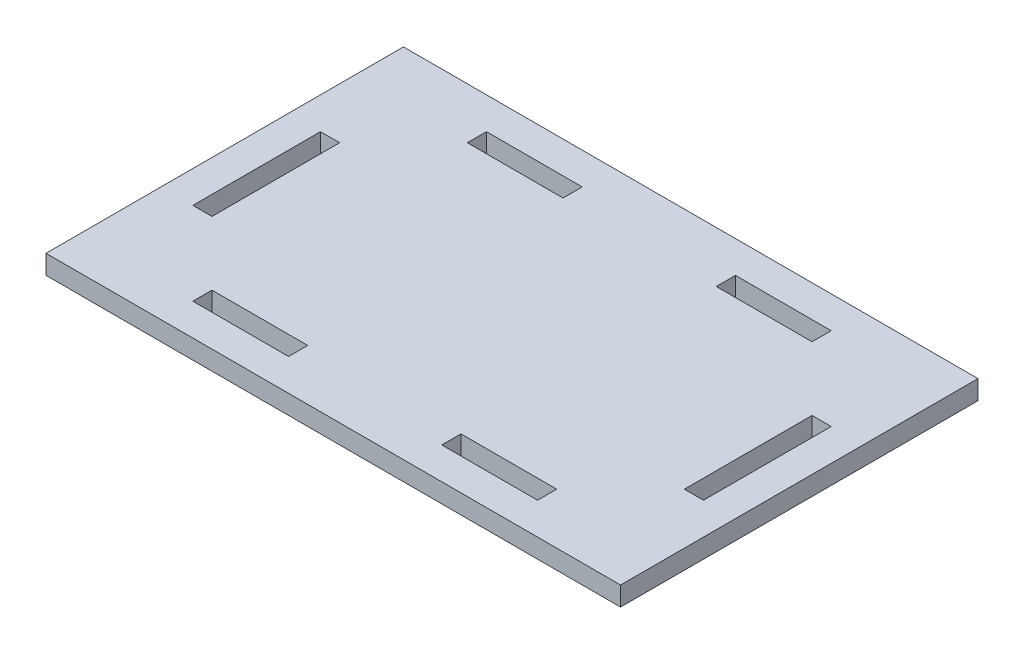
ISO-10303-21;
HEADER;
FILE_DESCRIPTION(('STEP AP214'),'2;1');
FILE_NAME('part.step','',(''),(''),'','','');
FILE_SCHEMA(('AUTOMOTIVE_DESIGN { 1 0 10303 214 1 1 1 1 }'));
ENDSEC;
DATA;
#1=APPLICATION_CONTEXT('core data for automotive mechanical design processes');
#2=APPLICATION_PROTOCOL_DEFINITION('international standard','automotive_design',2000,#1);
#3=PRODUCT_CONTEXT('',#1,'mechanical');
#4=PRODUCT('Part','Part','',(#3));
#5=PRODUCT_RELATED_PRODUCT_CATEGORY('part','',(#4));
#6=PRODUCT_DEFINITION_FORMATION('','',#4);
#7=PRODUCT_DEFINITION_CONTEXT('part definition',#1,'design');
#8=PRODUCT_DEFINITION('design','',#6,#7);
#9=PRODUCT_DEFINITION_SHAPE('','',#8);
#10=(LENGTH_UNIT() NAMED_UNIT(*) SI_UNIT(.MILLI.,.METRE.));
#11=(NAMED_UNIT(*) PLANE_ANGLE_UNIT() SI_UNIT($,.RADIAN.));
#12=(NAMED_UNIT(*) SI_UNIT($,.STERADIAN.) SOLID_ANGLE_UNIT());
#13=UNCERTAINTY_MEASURE_WITH_UNIT(LENGTH_MEASURE(1.E-05),#10,'distance_accuracy_value','');
#14=(GEOMETRIC_REPRESENTATION_CONTEXT(3) GLOBAL_UNCERTAINTY_ASSIGNED_CONTEXT((#13)) GLOBAL_UNIT_ASSIGNED_CONTEXT((#10,
#11,#12)) REPRESENTATION_CONTEXT('',''));
#15=CARTESIAN_POINT('',(0.,0.,0.));
#16=DIRECTION('',(0.,0.,1.));
#17=DIRECTION('',(1.,0.,0.));
#18=AXIS2_PLACEMENT_3D('',#15,#16,#17);
#19=CARTESIAN_POINT('',(0.,3.,0.));
#20=DIRECTION('',(0.,1.,0.));
#21=DIRECTION('',(0.,0.,1.));
#22=AXIS2_PLACEMENT_3D('',#19,#20,#21);
#23=PLANE('',#22);
#24=DIRECTION('',(0.,0.,-1.));
#25=VECTOR('',#24,1.);
#26=CARTESIAN_POINT('',(45.,3.,-28.));
#27=LINE('',#26,#25);
#28=CARTESIAN_POINT('',(45.,3.,28.));
#29=VERTEX_POINT('',#28);
#30=CARTESIAN_POINT('',(45.,3.,-28.));
#31=VERTEX_POINT('',#30);
#32=EDGE_CURVE('E414',#29,#31,#27,.T.);
#33=ORIENTED_EDGE('',*,*,#32,.T.);
#34=DIRECTION('',(-1.,0.,0.));
#35=VECTOR('',#34,1.);
#36=CARTESIAN_POINT('',(-45.,3.,-28.));
#37=LINE('',#36,#35);
#38=CARTESIAN_POINT('',(-45.,3.,-28.));
#39=VERTEX_POINT('',#38);
#40=EDGE_CURVE('E417',#31,#39,#37,.T.);
#41=ORIENTED_EDGE('',*,*,#40,.T.);
#42=DIRECTION('',(0.,0.,1.));
#43=VECTOR('',#42,1.);
#44=CARTESIAN_POINT('',(-45.,3.,-28.));
#45=LINE('',#44,#43);
#46=CARTESIAN_POINT('',(-45.,3.,28.));
#47=VERTEX_POINT('',#46);
#48=EDGE_CURVE('E420',#39,#47,#45,.T.);
#49=ORIENTED_EDGE('',*,*,#48,.T.);
#50=DIRECTION('',(1.,0.,0.));
#51=VECTOR('',#50,1.);
#52=CARTESIAN_POINT('',(-45.,3.,28.));
#53=LINE('',#52,#51);
#54=EDGE_CURVE('E422',#47,#29,#53,.T.);
#55=ORIENTED_EDGE('',*,*,#54,.T.);
#56=EDGE_LOOP('',(#33,#41,#49,#55));
#57=FACE_BOUND('',#56,.T.);
#58=DIRECTION('',(1.,0.,0.));
#59=VECTOR('',#58,1.);
#60=CARTESIAN_POINT('',(-40.,3.,10.));
#61=LINE('',#60,#59);
#62=CARTESIAN_POINT('',(-40.,3.,10.));
#63=VERTEX_POINT('',#62);
#64=CARTESIAN_POINT('',(-37.,3.,10.));
#65=VERTEX_POINT('',#64);
#66=EDGE_CURVE('E385',#63,#65,#61,.T.);
#67=ORIENTED_EDGE('',*,*,#66,.F.);
#68=DIRECTION('',(0.,0.,1.));
#69=VECTOR('',#68,1.);
#70=CARTESIAN_POINT('',(-40.,3.,-10.));
#71=LINE('',#70,#69);
#72=CARTESIAN_POINT('',(-40.,3.,-10.));
#73=VERTEX_POINT('',#72);
#74=EDGE_CURVE('E383',#73,#63,#71,.T.);
#75=ORIENTED_EDGE('',*,*,#74,.F.);
#76=DIRECTION('',(-1.,0.,0.));
#77=VECTOR('',#76,1.);
#78=CARTESIAN_POINT('',(-40.,3.,-10.));
#79=LINE('',#78,#77);
#80=CARTESIAN_POINT('',(-37.,3.,-10.));
#81=VERTEX_POINT('',#80);
#82=EDGE_CURVE('E391',#81,#73,#79,.T.);
#83=ORIENTED_EDGE('',*,*,#82,.F.);
#84=DIRECTION('',(0.,0.,-1.));
#85=VECTOR('',#84,1.);
#86=CARTESIAN_POINT('',(-37.,3.,-10.));
#87=LINE('',#86,#85);
#88=EDGE_CURVE('E388',#65,#81,#87,.T.);
#89=ORIENTED_EDGE('',*,*,#88,.F.);
#90=EDGE_LOOP('',(#67,#75,#83,#89));
#91=FACE_BOUND('',#90,.T.);
#92=DIRECTION('',(-1.,0.,0.));
#93=VECTOR('',#92,1.);
#94=CARTESIAN_POINT('',(40.,3.,-10.));
#95=LINE('',#94,#93);
#96=CARTESIAN_POINT('',(40.,3.,-10.));
#97=VERTEX_POINT('',#96);
#98=CARTESIAN_POINT('',(37.,3.,-10.));
#99=VERTEX_POINT('',#98);
#100=EDGE_CURVE('E354',#97,#99,#95,.T.);
#101=ORIENTED_EDGE('',*,*,#100,.F.);
#102=DIRECTION('',(0.,0.,-1.));
#103=VECTOR('',#102,1.);
#104=CARTESIAN_POINT('',(40.,3.,-10.));
#105=LINE('',#104,#103);
#106=CARTESIAN_POINT('',(40.,3.,10.));
#107=VERTEX_POINT('',#106);
#108=EDGE_CURVE('E352',#107,#97,#105,.T.);
#109=ORIENTED_EDGE('',*,*,#108,.F.);
#110=DIRECTION('',(1.,0.,0.));
#111=VECTOR('',#110,1.);
#112=CARTESIAN_POINT('',(40.,3.,10.));
#113=LINE('',#112,#111);
#114=CARTESIAN_POINT('',(37.,3.,10.));
#115=VERTEX_POINT('',#114);
#116=EDGE_CURVE('E360',#115,#107,#113,.T.);
#117=ORIENTED_EDGE('',*,*,#116,.F.);
#118=DIRECTION('',(0.,0.,1.));
#119=VECTOR('',#118,1.);
#120=CARTESIAN_POINT('',(37.,3.,-10.));
#121=LINE('',#120,#119);
#122=EDGE_CURVE('E357',#99,#115,#121,.T.);
#123=ORIENTED_EDGE('',*,*,#122,.F.);
#124=EDGE_LOOP('',(#101,#109,#117,#123));
#125=FACE_BOUND('',#124,.T.);
#126=DIRECTION('',(1.,0.,0.));
#127=VECTOR('',#126,1.);
#128=CARTESIAN_POINT('',(-27.,3.,-20.));
#129=LINE('',#128,#127);
#130=CARTESIAN_POINT('',(-27.,3.,-20.));
#131=VERTEX_POINT('',#130);
#132=CARTESIAN_POINT('',(-12.,3.,-20.));
#133=VERTEX_POINT('',#132);
#134=EDGE_CURVE('E323',#131,#133,#129,.T.);
#135=ORIENTED_EDGE('',*,*,#134,.F.);
#136=DIRECTION('',(0.,0.,1.));
#137=VECTOR('',#136,1.);
#138=CARTESIAN_POINT('',(-27.,3.,-23.));
#139=LINE('',#138,#137);
#140=CARTESIAN_POINT('',(-27.,3.,-23.));
#141=VERTEX_POINT('',#140);
#142=EDGE_CURVE('E321',#141,#131,#139,.T.);
#143=ORIENTED_EDGE('',*,*,#142,.F.);
#144=DIRECTION('',(-1.,0.,0.));
#145=VECTOR('',#144,1.);
#146=CARTESIAN_POINT('',(-27.,3.,-23.));
#147=LINE('',#146,#145);
#148=CARTESIAN_POINT('',(-12.,3.,-23.));
#149=VERTEX_POINT('',#148);
#150=EDGE_CURVE('E329',#149,#141,#147,.T.);
#151=ORIENTED_EDGE('',*,*,#150,.F.);
#152=DIRECTION('',(0.,0.,-1.));
#153=VECTOR('',#152,1.);
#154=CARTESIAN_POINT('',(-12.,3.,-23.));
#155=LINE('',#154,#153);
#156=EDGE_CURVE('E326',#133,#149,#155,.T.);
#157=ORIENTED_EDGE('',*,*,#156,.F.);
#158=EDGE_LOOP('',(#135,#143,#151,#157));
#159=FACE_BOUND('',#158,.T.);
#160=DIRECTION('',(-1.,0.,0.));
#161=VECTOR('',#160,1.);
#162=CARTESIAN_POINT('',(27.,3.,-23.));
#163=LINE('',#162,#161);
#164=CARTESIAN_POINT('',(27.,3.,-23.));
#165=VERTEX_POINT('',#164);
#166=CARTESIAN_POINT('',(12.,3.,-23.));
#167=VERTEX_POINT('',#166);
#168=EDGE_CURVE('E292',#165,#167,#163,.T.);
#169=ORIENTED_EDGE('',*,*,#168,.F.);
#170=DIRECTION('',(0.,0.,-1.));
#171=VECTOR('',#170,1.);
#172=CARTESIAN_POINT('',(27.,3.,-23.));
#173=LINE('',#172,#171);
#174=CARTESIAN_POINT('',(27.,3.,-20.));
#175=VERTEX_POINT('',#174);
#176=EDGE_CURVE('E290',#175,#165,#173,.T.);
#177=ORIENTED_EDGE('',*,*,#176,.F.);
#178=DIRECTION('',(1.,0.,0.));
#179=VECTOR('',#178,1.);
#180=CARTESIAN_POINT('',(27.,3.,-20.));
#181=LINE('',#180,#179);
#182=CARTESIAN_POINT('',(12.,3.,-20.));
#183=VERTEX_POINT('',#182);
#184=EDGE_CURVE('E298',#183,#175,#181,.T.);
#185=ORIENTED_EDGE('',*,*,#184,.F.);
#186=DIRECTION('',(0.,0.,1.));
#187=VECTOR('',#186,1.);
#188=CARTESIAN_POINT('',(12.,3.,-23.));
#189=LINE('',#188,#187);
#190=EDGE_CURVE('E295',#167,#183,#189,.T.);
#191=ORIENTED_EDGE('',*,*,#190,.F.);
#192=EDGE_LOOP('',(#169,#177,#185,#191));
#193=FACE_BOUND('',#192,.T.);
#194=DIRECTION('',(0.,0.,-1.));
#195=VECTOR('',#194,1.);
#196=CARTESIAN_POINT('',(27.,3.,23.));
#197=LINE('',#196,#195);
#198=CARTESIAN_POINT('',(27.,3.,23.));
#199=VERTEX_POINT('',#198);
#200=CARTESIAN_POINT('',(27.,3.,20.));
#201=VERTEX_POINT('',#200);
#202=EDGE_CURVE('E261',#199,#201,#197,.T.);
#203=ORIENTED_EDGE('',*,*,#202,.F.);
#204=DIRECTION('',(1.,0.,0.));
#205=VECTOR('',#204,1.);
#206=CARTESIAN_POINT('',(27.,3.,23.));
#207=LINE('',#206,#205);
#208=CARTESIAN_POINT('',(12.,3.,23.));
#209=VERTEX_POINT('',#208);
#210=EDGE_CURVE('E259',#209,#199,#207,.T.);
#211=ORIENTED_EDGE('',*,*,#210,.F.);
#212=DIRECTION('',(0.,0.,1.));
#213=VECTOR('',#212,1.);
#214=CARTESIAN_POINT('',(12.,3.,23.));
#215=LINE('',#214,#213);
#216=CARTESIAN_POINT('',(12.,3.,20.));
#217=VERTEX_POINT('',#216);
#218=EDGE_CURVE('E267',#217,#209,#215,.T.);
#219=ORIENTED_EDGE('',*,*,#218,.F.);
#220=DIRECTION('',(-1.,0.,0.));
#221=VECTOR('',#220,1.);
#222=CARTESIAN_POINT('',(27.,3.,20.));
#223=LINE('',#222,#221);
#224=EDGE_CURVE('E264',#201,#217,#223,.T.);
#225=ORIENTED_EDGE('',*,*,#224,.F.);
#226=EDGE_LOOP('',(#203,#211,#219,#225));
#227=FACE_BOUND('',#226,.T.);
#228=DIRECTION('',(1.,0.,0.));
#229=VECTOR('',#228,1.);
#230=CARTESIAN_POINT('',(-27.,3.,23.));
#231=LINE('',#230,#229);
#232=CARTESIAN_POINT('',(-27.,3.,23.));
#233=VERTEX_POINT('',#232);
#234=CARTESIAN_POINT('',(-12.,3.,23.));
#235=VERTEX_POINT('',#234);
#236=EDGE_CURVE('E231',#233,#235,#231,.T.);
#237=ORIENTED_EDGE('',*,*,#236,.F.);
#238=DIRECTION('',(0.,0.,1.));
#239=VECTOR('',#238,1.);
#240=CARTESIAN_POINT('',(-27.,3.,23.));
#241=LINE('',#240,#239);
#242=CARTESIAN_POINT('',(-27.,3.,20.));
#243=VERTEX_POINT('',#242);
#244=EDGE_CURVE('E223',#243,#233,#241,.T.);
#245=ORIENTED_EDGE('',*,*,#244,.F.);
#246=DIRECTION('',(-1.,0.,0.));
#247=VECTOR('',#246,1.);
#248=CARTESIAN_POINT('',(-27.,3.,20.));
#249=LINE('',#248,#247);
#250=CARTESIAN_POINT('',(-12.,3.,20.));
#251=VERTEX_POINT('',#250);
#252=EDGE_CURVE('E245',#251,#243,#249,.T.);
#253=ORIENTED_EDGE('',*,*,#252,.F.);
#254=DIRECTION('',(0.,0.,-1.));
#255=VECTOR('',#254,1.);
#256=CARTESIAN_POINT('',(-12.,3.,23.));
#257=LINE('',#256,#255);
#258=EDGE_CURVE('E243',#235,#251,#257,.T.);
#259=ORIENTED_EDGE('',*,*,#258,.F.);
#260=EDGE_LOOP('',(#237,#245,#253,#259));
#261=FACE_BOUND('',#260,.T.);
#262=ADVANCED_FACE('F38',(#57,#91,#125,#159,#193,#227,#261),#23,.T.);
#263=CARTESIAN_POINT('',(0.,0.,0.));
#264=DIRECTION('',(0.,1.,0.));
#265=DIRECTION('',(0.,0.,1.));
#266=AXIS2_PLACEMENT_3D('',#263,#264,#265);
#267=PLANE('',#266);
#268=DIRECTION('',(1.,0.,0.));
#269=VECTOR('',#268,1.);
#270=CARTESIAN_POINT('',(27.,0.,23.));
#271=LINE('',#270,#269);
#272=CARTESIAN_POINT('',(12.,0.,23.));
#273=VERTEX_POINT('',#272);
#274=CARTESIAN_POINT('',(27.,0.,23.));
#275=VERTEX_POINT('',#274);
#276=EDGE_CURVE('E239',#273,#275,#271,.T.);
#277=ORIENTED_EDGE('',*,*,#276,.T.);
#278=DIRECTION('',(0.,0.,-1.));
#279=VECTOR('',#278,1.);
#280=CARTESIAN_POINT('',(27.,0.,23.));
#281=LINE('',#280,#279);
#282=CARTESIAN_POINT('',(27.,0.,20.));
#283=VERTEX_POINT('',#282);
#284=EDGE_CURVE('E272',#275,#283,#281,.T.);
#285=ORIENTED_EDGE('',*,*,#284,.T.);
#286=DIRECTION('',(-1.,0.,0.));
#287=VECTOR('',#286,1.);
#288=CARTESIAN_POINT('',(27.,0.,20.));
#289=LINE('',#288,#287);
#290=CARTESIAN_POINT('',(12.,0.,20.));
#291=VERTEX_POINT('',#290);
#292=EDGE_CURVE('E275',#283,#291,#289,.T.);
#293=ORIENTED_EDGE('',*,*,#292,.T.);
#294=DIRECTION('',(0.,0.,1.));
#295=VECTOR('',#294,1.);
#296=CARTESIAN_POINT('',(12.,0.,23.));
#297=LINE('',#296,#295);
#298=EDGE_CURVE('E262',#291,#273,#297,.T.);
#299=ORIENTED_EDGE('',*,*,#298,.T.);
#300=EDGE_LOOP('',(#277,#285,#293,#299));
#301=FACE_BOUND('',#300,.T.);
#302=DIRECTION('',(0.,0.,1.));
#303=VECTOR('',#302,1.);
#304=CARTESIAN_POINT('',(-27.,0.,-23.));
#305=LINE('',#304,#303);
#306=CARTESIAN_POINT('',(-27.,0.,-23.));
#307=VERTEX_POINT('',#306);
#308=CARTESIAN_POINT('',(-27.,0.,-20.));
#309=VERTEX_POINT('',#308);
#310=EDGE_CURVE('E320',#307,#309,#305,.T.);
#311=ORIENTED_EDGE('',*,*,#310,.T.);
#312=DIRECTION('',(1.,0.,0.));
#313=VECTOR('',#312,1.);
#314=CARTESIAN_POINT('',(-27.,0.,-20.));
#315=LINE('',#314,#313);
#316=CARTESIAN_POINT('',(-12.,0.,-20.));
#317=VERTEX_POINT('',#316);
#318=EDGE_CURVE('E334',#309,#317,#315,.T.);
#319=ORIENTED_EDGE('',*,*,#318,.T.);
#320=DIRECTION('',(0.,0.,-1.));
#321=VECTOR('',#320,1.);
#322=CARTESIAN_POINT('',(-12.,0.,-23.));
#323=LINE('',#322,#321);
#324=CARTESIAN_POINT('',(-12.,0.,-23.));
#325=VERTEX_POINT('',#324);
#326=EDGE_CURVE('E337',#317,#325,#323,.T.);
#327=ORIENTED_EDGE('',*,*,#326,.T.);
#328=DIRECTION('',(-1.,0.,0.));
#329=VECTOR('',#328,1.);
#330=CARTESIAN_POINT('',(-27.,0.,-23.));
#331=LINE('',#330,#329);
#332=EDGE_CURVE('E324',#325,#307,#331,.T.);
#333=ORIENTED_EDGE('',*,*,#332,.T.);
#334=EDGE_LOOP('',(#311,#319,#327,#333));
#335=FACE_BOUND('',#334,.T.);
#336=DIRECTION('',(0.,0.,1.));
#337=VECTOR('',#336,1.);
#338=CARTESIAN_POINT('',(-40.,0.,-10.));
#339=LINE('',#338,#337);
#340=CARTESIAN_POINT('',(-40.,0.,-10.));
#341=VERTEX_POINT('',#340);
#342=CARTESIAN_POINT('',(-40.,0.,10.));
#343=VERTEX_POINT('',#342);
#344=EDGE_CURVE('E382',#341,#343,#339,.T.);
#345=ORIENTED_EDGE('',*,*,#344,.T.);
#346=DIRECTION('',(1.,0.,0.));
#347=VECTOR('',#346,1.);
#348=CARTESIAN_POINT('',(-40.,0.,10.));
#349=LINE('',#348,#347);
#350=CARTESIAN_POINT('',(-37.,0.,10.));
#351=VERTEX_POINT('',#350);
#352=EDGE_CURVE('E396',#343,#351,#349,.T.);
#353=ORIENTED_EDGE('',*,*,#352,.T.);
#354=DIRECTION('',(0.,0.,-1.));
#355=VECTOR('',#354,1.);
#356=CARTESIAN_POINT('',(-37.,0.,-10.));
#357=LINE('',#356,#355);
#358=CARTESIAN_POINT('',(-37.,0.,-10.));
#359=VERTEX_POINT('',#358);
#360=EDGE_CURVE('E399',#351,#359,#357,.T.);
#361=ORIENTED_EDGE('',*,*,#360,.T.);
#362=DIRECTION('',(-1.,0.,0.));
#363=VECTOR('',#362,1.);
#364=CARTESIAN_POINT('',(-40.,0.,-10.));
#365=LINE('',#364,#363);
#366=EDGE_CURVE('E386',#359,#341,#365,.T.);
#367=ORIENTED_EDGE('',*,*,#366,.T.);
#368=EDGE_LOOP('',(#345,#353,#361,#367));
#369=FACE_BOUND('',#368,.T.);
#370=DIRECTION('',(0.,0.,-1.));
#371=VECTOR('',#370,1.);
#372=CARTESIAN_POINT('',(45.,0.,-28.));
#373=LINE('',#372,#371);
#374=CARTESIAN_POINT('',(45.,0.,28.));
#375=VERTEX_POINT('',#374);
#376=CARTESIAN_POINT('',(45.,0.,-28.));
#377=VERTEX_POINT('',#376);
#378=EDGE_CURVE('E413',#375,#377,#373,.T.);
#379=ORIENTED_EDGE('',*,*,#378,.F.);
#380=DIRECTION('',(1.,0.,0.));
#381=VECTOR('',#380,1.);
#382=CARTESIAN_POINT('',(-45.,0.,28.));
#383=LINE('',#382,#381);
#384=CARTESIAN_POINT('',(-45.,0.,28.));
#385=VERTEX_POINT('',#384);
#386=EDGE_CURVE('E418',#385,#375,#383,.T.);
#387=ORIENTED_EDGE('',*,*,#386,.F.);
#388=DIRECTION('',(0.,0.,1.));
#389=VECTOR('',#388,1.);
#390=CARTESIAN_POINT('',(-45.,0.,-28.));
#391=LINE('',#390,#389);
#392=CARTESIAN_POINT('',(-45.,0.,-28.));
#393=VERTEX_POINT('',#392);
#394=EDGE_CURVE('E429',#393,#385,#391,.T.);
#395=ORIENTED_EDGE('',*,*,#394,.F.);
#396=DIRECTION('',(-1.,0.,0.));
#397=VECTOR('',#396,1.);
#398=CARTESIAN_POINT('',(-45.,0.,-28.));
#399=LINE('',#398,#397);
#400=EDGE_CURVE('E427',#377,#393,#399,.T.);
#401=ORIENTED_EDGE('',*,*,#400,.F.);
#402=EDGE_LOOP('',(#379,#387,#395,#401));
#403=FACE_BOUND('',#402,.T.);
#404=DIRECTION('',(0.,0.,-1.));
#405=VECTOR('',#404,1.);
#406=CARTESIAN_POINT('',(40.,0.,-10.));
#407=LINE('',#406,#405);
#408=CARTESIAN_POINT('',(40.,0.,10.));
#409=VERTEX_POINT('',#408);
#410=CARTESIAN_POINT('',(40.,0.,-10.));
#411=VERTEX_POINT('',#410);
#412=EDGE_CURVE('E351',#409,#411,#407,.T.);
#413=ORIENTED_EDGE('',*,*,#412,.T.);
#414=DIRECTION('',(-1.,0.,0.));
#415=VECTOR('',#414,1.);
#416=CARTESIAN_POINT('',(40.,0.,-10.));
#417=LINE('',#416,#415);
#418=CARTESIAN_POINT('',(37.,0.,-10.));
#419=VERTEX_POINT('',#418);
#420=EDGE_CURVE('E365',#411,#419,#417,.T.);
#421=ORIENTED_EDGE('',*,*,#420,.T.);
#422=DIRECTION('',(0.,0.,1.));
#423=VECTOR('',#422,1.);
#424=CARTESIAN_POINT('',(37.,0.,-10.));
#425=LINE('',#424,#423);
#426=CARTESIAN_POINT('',(37.,0.,10.));
#427=VERTEX_POINT('',#426);
#428=EDGE_CURVE('E368',#419,#427,#425,.T.);
#429=ORIENTED_EDGE('',*,*,#428,.T.);
#430=DIRECTION('',(1.,0.,0.));
#431=VECTOR('',#430,1.);
#432=CARTESIAN_POINT('',(40.,0.,10.));
#433=LINE('',#432,#431);
#434=EDGE_CURVE('E355',#427,#409,#433,.T.);
#435=ORIENTED_EDGE('',*,*,#434,.T.);
#436=EDGE_LOOP('',(#413,#421,#429,#435));
#437=FACE_BOUND('',#436,.T.);
#438=DIRECTION('',(0.,0.,-1.));
#439=VECTOR('',#438,1.);
#440=CARTESIAN_POINT('',(27.,0.,-23.));
#441=LINE('',#440,#439);
#442=CARTESIAN_POINT('',(27.,0.,-20.));
#443=VERTEX_POINT('',#442);
#444=CARTESIAN_POINT('',(27.,0.,-23.));
#445=VERTEX_POINT('',#444);
#446=EDGE_CURVE('E289',#443,#445,#441,.T.);
#447=ORIENTED_EDGE('',*,*,#446,.T.);
#448=DIRECTION('',(-1.,0.,0.));
#449=VECTOR('',#448,1.);
#450=CARTESIAN_POINT('',(27.,0.,-23.));
#451=LINE('',#450,#449);
#452=CARTESIAN_POINT('',(12.,0.,-23.));
#453=VERTEX_POINT('',#452);
#454=EDGE_CURVE('E303',#445,#453,#451,.T.);
#455=ORIENTED_EDGE('',*,*,#454,.T.);
#456=DIRECTION('',(0.,0.,1.));
#457=VECTOR('',#456,1.);
#458=CARTESIAN_POINT('',(12.,0.,-23.));
#459=LINE('',#458,#457);
#460=CARTESIAN_POINT('',(12.,0.,-20.));
#461=VERTEX_POINT('',#460);
#462=EDGE_CURVE('E306',#453,#461,#459,.T.);
#463=ORIENTED_EDGE('',*,*,#462,.T.);
#464=DIRECTION('',(1.,0.,0.));
#465=VECTOR('',#464,1.);
#466=CARTESIAN_POINT('',(27.,0.,-20.));
#467=LINE('',#466,#465);
#468=EDGE_CURVE('E293',#461,#443,#467,.T.);
#469=ORIENTED_EDGE('',*,*,#468,.T.);
#470=EDGE_LOOP('',(#447,#455,#463,#469));
#471=FACE_BOUND('',#470,.T.);
#472=DIRECTION('',(0.,0.,1.));
#473=VECTOR('',#472,1.);
#474=CARTESIAN_POINT('',(-27.,0.,23.));
#475=LINE('',#474,#473);
#476=CARTESIAN_POINT('',(-27.,0.,20.));
#477=VERTEX_POINT('',#476);
#478=CARTESIAN_POINT('',(-27.,0.,23.));
#479=VERTEX_POINT('',#478);
#480=EDGE_CURVE('E61',#477,#479,#475,.T.);
#481=ORIENTED_EDGE('',*,*,#480,.T.);
#482=DIRECTION('',(1.,0.,0.));
#483=VECTOR('',#482,1.);
#484=CARTESIAN_POINT('',(-27.,0.,23.));
#485=LINE('',#484,#483);
#486=CARTESIAN_POINT('',(-12.,0.,23.));
#487=VERTEX_POINT('',#486);
#488=EDGE_CURVE('E238',#479,#487,#485,.T.);
#489=ORIENTED_EDGE('',*,*,#488,.T.);
#490=DIRECTION('',(0.,0.,-1.));
#491=VECTOR('',#490,1.);
#492=CARTESIAN_POINT('',(-12.,0.,23.));
#493=LINE('',#492,#491);
#494=CARTESIAN_POINT('',(-12.,0.,20.));
#495=VERTEX_POINT('',#494);
#496=EDGE_CURVE('E251',#487,#495,#493,.T.);
#497=ORIENTED_EDGE('',*,*,#496,.T.);
#498=DIRECTION('',(-1.,0.,0.));
#499=VECTOR('',#498,1.);
#500=CARTESIAN_POINT('',(-27.,0.,20.));
#501=LINE('',#500,#499);
#502=EDGE_CURVE('E232',#495,#477,#501,.T.);
#503=ORIENTED_EDGE('',*,*,#502,.T.);
#504=EDGE_LOOP('',(#481,#489,#497,#503));
#505=FACE_BOUND('',#504,.T.);
#506=ADVANCED_FACE('F447',(#301,#335,#369,#403,#437,#471,#505),#267,.F.);
#507=CARTESIAN_POINT('',(45.,3.,-28.));
#508=DIRECTION('',(-1.,0.,0.));
#509=DIRECTION('',(0.,0.,1.));
#510=AXIS2_PLACEMENT_3D('',#507,#508,#509);
#511=PLANE('',#510);
#512=ORIENTED_EDGE('',*,*,#378,.T.);
#513=DIRECTION('',(0.,-1.,0.));
#514=VECTOR('',#513,1.);
#515=CARTESIAN_POINT('',(45.,3.,-28.));
#516=LINE('',#515,#514);
#517=EDGE_CURVE('E11',#31,#377,#516,.T.);
#518=ORIENTED_EDGE('',*,*,#517,.F.);
#519=ORIENTED_EDGE('',*,*,#32,.F.);
#520=DIRECTION('',(0.,-1.,0.));
#521=VECTOR('',#520,1.);
#522=CARTESIAN_POINT('',(45.,3.,28.));
#523=LINE('',#522,#521);
#524=EDGE_CURVE('E424',#29,#375,#523,.T.);
#525=ORIENTED_EDGE('',*,*,#524,.T.);
#526=EDGE_LOOP('',(#512,#518,#519,#525));
#527=FACE_BOUND('',#526,.T.);
#528=ADVANCED_FACE('F40',(#527),#511,.F.);
#529=CARTESIAN_POINT('',(-45.,3.,-28.));
#530=DIRECTION('',(0.,0.,1.));
#531=DIRECTION('',(1.,0.,0.));
#532=AXIS2_PLACEMENT_3D('',#529,#530,#531);
#533=PLANE('',#532);
#534=ORIENTED_EDGE('',*,*,#400,.T.);
#535=DIRECTION('',(0.,-1.,0.));
#536=VECTOR('',#535,1.);
#537=CARTESIAN_POINT('',(-45.,3.,-28.));
#538=LINE('',#537,#536);
#539=EDGE_CURVE('E46',#39,#393,#538,.T.);
#540=ORIENTED_EDGE('',*,*,#539,.F.);
#541=ORIENTED_EDGE('',*,*,#40,.F.);
#542=ORIENTED_EDGE('',*,*,#517,.T.);
#543=EDGE_LOOP('',(#534,#540,#541,#542));
#544=FACE_BOUND('',#543,.T.);
#545=ADVANCED_FACE('F458',(#544),#533,.F.);
#546=CARTESIAN_POINT('',(-45.,3.,-28.));
#547=DIRECTION('',(1.,0.,0.));
#548=DIRECTION('',(0.,0.,-1.));
#549=AXIS2_PLACEMENT_3D('',#546,#547,#548);
#550=PLANE('',#549);
#551=ORIENTED_EDGE('',*,*,#394,.T.);
#552=DIRECTION('',(0.,-1.,0.));
#553=VECTOR('',#552,1.);
#554=CARTESIAN_POINT('',(-45.,3.,28.));
#555=LINE('',#554,#553);
#556=EDGE_CURVE('E434',#47,#385,#555,.T.);
#557=ORIENTED_EDGE('',*,*,#556,.F.);
#558=ORIENTED_EDGE('',*,*,#48,.F.);
#559=ORIENTED_EDGE('',*,*,#539,.T.);
#560=EDGE_LOOP('',(#551,#557,#558,#559));
#561=FACE_BOUND('',#560,.T.);
#562=ADVANCED_FACE('F441',(#561),#550,.F.);
#563=CARTESIAN_POINT('',(-45.,3.,28.));
#564=DIRECTION('',(0.,0.,-1.));
#565=DIRECTION('',(-1.,0.,0.));
#566=AXIS2_PLACEMENT_3D('',#563,#564,#565);
#567=PLANE('',#566);
#568=ORIENTED_EDGE('',*,*,#386,.T.);
#569=ORIENTED_EDGE('',*,*,#524,.F.);
#570=ORIENTED_EDGE('',*,*,#54,.F.);
#571=ORIENTED_EDGE('',*,*,#556,.T.);
#572=EDGE_LOOP('',(#568,#569,#570,#571));
#573=FACE_BOUND('',#572,.T.);
#574=ADVANCED_FACE('F451',(#573),#567,.F.);
#575=CARTESIAN_POINT('',(-40.,3.,-10.));
#576=DIRECTION('',(1.,0.,0.));
#577=DIRECTION('',(0.,0.,-1.));
#578=AXIS2_PLACEMENT_3D('',#575,#576,#577);
#579=PLANE('',#578);
#580=ORIENTED_EDGE('',*,*,#344,.F.);
#581=DIRECTION('',(0.,-1.,0.));
#582=VECTOR('',#581,1.);
#583=CARTESIAN_POINT('',(-40.,3.,-10.));
#584=LINE('',#583,#582);
#585=EDGE_CURVE('E393',#73,#341,#584,.T.);
#586=ORIENTED_EDGE('',*,*,#585,.F.);
#587=ORIENTED_EDGE('',*,*,#74,.T.);
#588=DIRECTION('',(0.,-1.,0.));
#589=VECTOR('',#588,1.);
#590=CARTESIAN_POINT('',(-40.,3.,10.));
#591=LINE('',#590,#589);
#592=EDGE_CURVE('E410',#63,#343,#591,.T.);
#593=ORIENTED_EDGE('',*,*,#592,.T.);
#594=EDGE_LOOP('',(#580,#586,#587,#593));
#595=FACE_BOUND('',#594,.T.);
#596=ADVANCED_FACE('F473',(#595),#579,.T.);
#597=CARTESIAN_POINT('',(-40.,3.,10.));
#598=DIRECTION('',(0.,0.,-1.));
#599=DIRECTION('',(-1.,0.,0.));
#600=AXIS2_PLACEMENT_3D('',#597,#598,#599);
#601=PLANE('',#600);
#602=ORIENTED_EDGE('',*,*,#352,.F.);
#603=ORIENTED_EDGE('',*,*,#592,.F.);
#604=ORIENTED_EDGE('',*,*,#66,.T.);
#605=DIRECTION('',(0.,-1.,0.));
#606=VECTOR('',#605,1.);
#607=CARTESIAN_POINT('',(-37.,3.,10.));
#608=LINE('',#607,#606);
#609=EDGE_CURVE('E408',#65,#351,#608,.T.);
#610=ORIENTED_EDGE('',*,*,#609,.T.);
#611=EDGE_LOOP('',(#602,#603,#604,#610));
#612=FACE_BOUND('',#611,.T.);
#613=ADVANCED_FACE('F480',(#612),#601,.T.);
#614=CARTESIAN_POINT('',(-37.,3.,-10.));
#615=DIRECTION('',(-1.,0.,0.));
#616=DIRECTION('',(0.,0.,1.));
#617=AXIS2_PLACEMENT_3D('',#614,#615,#616);
#618=PLANE('',#617);
#619=ORIENTED_EDGE('',*,*,#360,.F.);
#620=ORIENTED_EDGE('',*,*,#609,.F.);
#621=ORIENTED_EDGE('',*,*,#88,.T.);
#622=DIRECTION('',(0.,-1.,0.));
#623=VECTOR('',#622,1.);
#624=CARTESIAN_POINT('',(-37.,3.,-10.));
#625=LINE('',#624,#623);
#626=EDGE_CURVE('E406',#81,#359,#625,.T.);
#627=ORIENTED_EDGE('',*,*,#626,.T.);
#628=EDGE_LOOP('',(#619,#620,#621,#627));
#629=FACE_BOUND('',#628,.T.);
#630=ADVANCED_FACE('F485',(#629),#618,.T.);
#631=CARTESIAN_POINT('',(-40.,3.,-10.));
#632=DIRECTION('',(0.,0.,1.));
#633=DIRECTION('',(1.,0.,0.));
#634=AXIS2_PLACEMENT_3D('',#631,#632,#633);
#635=PLANE('',#634);
#636=ORIENTED_EDGE('',*,*,#366,.F.);
#637=ORIENTED_EDGE('',*,*,#626,.F.);
#638=ORIENTED_EDGE('',*,*,#82,.T.);
#639=ORIENTED_EDGE('',*,*,#585,.T.);
#640=EDGE_LOOP('',(#636,#637,#638,#639));
#641=FACE_BOUND('',#640,.T.);
#642=ADVANCED_FACE('F493',(#641),#635,.T.);
#643=CARTESIAN_POINT('',(40.,3.,-10.));
#644=DIRECTION('',(-1.,0.,0.));
#645=DIRECTION('',(0.,0.,1.));
#646=AXIS2_PLACEMENT_3D('',#643,#644,#645);
#647=PLANE('',#646);
#648=ORIENTED_EDGE('',*,*,#412,.F.);
#649=DIRECTION('',(0.,-1.,0.));
#650=VECTOR('',#649,1.);
#651=CARTESIAN_POINT('',(40.,3.,10.));
#652=LINE('',#651,#650);
#653=EDGE_CURVE('E362',#107,#409,#652,.T.);
#654=ORIENTED_EDGE('',*,*,#653,.F.);
#655=ORIENTED_EDGE('',*,*,#108,.T.);
#656=DIRECTION('',(0.,-1.,0.));
#657=VECTOR('',#656,1.);
#658=CARTESIAN_POINT('',(40.,3.,-10.));
#659=LINE('',#658,#657);
#660=EDGE_CURVE('E379',#97,#411,#659,.T.);
#661=ORIENTED_EDGE('',*,*,#660,.T.);
#662=EDGE_LOOP('',(#648,#654,#655,#661));
#663=FACE_BOUND('',#662,.T.);
#664=ADVANCED_FACE('F588',(#663),#647,.T.);
#665=CARTESIAN_POINT('',(40.,3.,-10.));
#666=DIRECTION('',(0.,0.,1.));
#667=DIRECTION('',(1.,0.,0.));
#668=AXIS2_PLACEMENT_3D('',#665,#666,#667);
#669=PLANE('',#668);
#670=ORIENTED_EDGE('',*,*,#420,.F.);
#671=ORIENTED_EDGE('',*,*,#660,.F.);
#672=ORIENTED_EDGE('',*,*,#100,.T.);
#673=DIRECTION('',(0.,-1.,0.));
#674=VECTOR('',#673,1.);
#675=CARTESIAN_POINT('',(37.,3.,-10.));
#676=LINE('',#675,#674);
#677=EDGE_CURVE('E377',#99,#419,#676,.T.);
#678=ORIENTED_EDGE('',*,*,#677,.T.);
#679=EDGE_LOOP('',(#670,#671,#672,#678));
#680=FACE_BOUND('',#679,.T.);
#681=ADVANCED_FACE('F584',(#680),#669,.T.);
#682=CARTESIAN_POINT('',(37.,3.,-10.));
#683=DIRECTION('',(1.,0.,0.));
#684=DIRECTION('',(0.,0.,-1.));
#685=AXIS2_PLACEMENT_3D('',#682,#683,#684);
#686=PLANE('',#685);
#687=ORIENTED_EDGE('',*,*,#428,.F.);
#688=ORIENTED_EDGE('',*,*,#677,.F.);
#689=ORIENTED_EDGE('',*,*,#122,.T.);
#690=DIRECTION('',(0.,-1.,0.));
#691=VECTOR('',#690,1.);
#692=CARTESIAN_POINT('',(37.,3.,10.));
#693=LINE('',#692,#691);
#694=EDGE_CURVE('E375',#115,#427,#693,.T.);
#695=ORIENTED_EDGE('',*,*,#694,.T.);
#696=EDGE_LOOP('',(#687,#688,#689,#695));
#697=FACE_BOUND('',#696,.T.);
#698=ADVANCED_FACE('F580',(#697),#686,.T.);
#699=CARTESIAN_POINT('',(40.,3.,10.));
#700=DIRECTION('',(0.,0.,-1.));
#701=DIRECTION('',(-1.,0.,0.));
#702=AXIS2_PLACEMENT_3D('',#699,#700,#701);
#703=PLANE('',#702);
#704=ORIENTED_EDGE('',*,*,#434,.F.);
#705=ORIENTED_EDGE('',*,*,#694,.F.);
#706=ORIENTED_EDGE('',*,*,#116,.T.);
#707=ORIENTED_EDGE('',*,*,#653,.T.);
#708=EDGE_LOOP('',(#704,#705,#706,#707));
#709=FACE_BOUND('',#708,.T.);
#710=ADVANCED_FACE('F576',(#709),#703,.T.);
#711=CARTESIAN_POINT('',(-27.,3.,-23.));
#712=DIRECTION('',(1.,0.,0.));
#713=DIRECTION('',(0.,0.,-1.));
#714=AXIS2_PLACEMENT_3D('',#711,#712,#713);
#715=PLANE('',#714);
#716=ORIENTED_EDGE('',*,*,#310,.F.);
#717=DIRECTION('',(0.,-1.,0.));
#718=VECTOR('',#717,1.);
#719=CARTESIAN_POINT('',(-27.,3.,-23.));
#720=LINE('',#719,#718);
#721=EDGE_CURVE('E331',#141,#307,#720,.T.);
#722=ORIENTED_EDGE('',*,*,#721,.F.);
#723=ORIENTED_EDGE('',*,*,#142,.T.);
#724=DIRECTION('',(0.,-1.,0.));
#725=VECTOR('',#724,1.);
#726=CARTESIAN_POINT('',(-27.,3.,-20.));
#727=LINE('',#726,#725);
#728=EDGE_CURVE('E348',#131,#309,#727,.T.);
#729=ORIENTED_EDGE('',*,*,#728,.T.);
#730=EDGE_LOOP('',(#716,#722,#723,#729));
#731=FACE_BOUND('',#730,.T.);
#732=ADVANCED_FACE('F572',(#731),#715,.T.);
#733=CARTESIAN_POINT('',(-27.,3.,-20.));
#734=DIRECTION('',(0.,0.,-1.));
#735=DIRECTION('',(-1.,0.,0.));
#736=AXIS2_PLACEMENT_3D('',#733,#734,#735);
#737=PLANE('',#736);
#738=ORIENTED_EDGE('',*,*,#318,.F.);
#739=ORIENTED_EDGE('',*,*,#728,.F.);
#740=ORIENTED_EDGE('',*,*,#134,.T.);
#741=DIRECTION('',(0.,-1.,0.));
#742=VECTOR('',#741,1.);
#743=CARTESIAN_POINT('',(-12.,3.,-20.));
#744=LINE('',#743,#742);
#745=EDGE_CURVE('E346',#133,#317,#744,.T.);
#746=ORIENTED_EDGE('',*,*,#745,.T.);
#747=EDGE_LOOP('',(#738,#739,#740,#746));
#748=FACE_BOUND('',#747,.T.);
#749=ADVANCED_FACE('F568',(#748),#737,.T.);
#750=CARTESIAN_POINT('',(-12.,3.,-23.));
#751=DIRECTION('',(-1.,0.,0.));
#752=DIRECTION('',(0.,0.,1.));
#753=AXIS2_PLACEMENT_3D('',#750,#751,#752);
#754=PLANE('',#753);
#755=ORIENTED_EDGE('',*,*,#326,.F.);
#756=ORIENTED_EDGE('',*,*,#745,.F.);
#757=ORIENTED_EDGE('',*,*,#156,.T.);
#758=DIRECTION('',(0.,-1.,0.));
#759=VECTOR('',#758,1.);
#760=CARTESIAN_POINT('',(-12.,3.,-23.));
#761=LINE('',#760,#759);
#762=EDGE_CURVE('E344',#149,#325,#761,.T.);
#763=ORIENTED_EDGE('',*,*,#762,.T.);
#764=EDGE_LOOP('',(#755,#756,#757,#763));
#765=FACE_BOUND('',#764,.T.);
#766=ADVANCED_FACE('F564',(#765),#754,.T.);
#767=CARTESIAN_POINT('',(-27.,3.,-23.));
#768=DIRECTION('',(0.,0.,1.));
#769=DIRECTION('',(1.,0.,0.));
#770=AXIS2_PLACEMENT_3D('',#767,#768,#769);
#771=PLANE('',#770);
#772=ORIENTED_EDGE('',*,*,#332,.F.);
#773=ORIENTED_EDGE('',*,*,#762,.F.);
#774=ORIENTED_EDGE('',*,*,#150,.T.);
#775=ORIENTED_EDGE('',*,*,#721,.T.);
#776=EDGE_LOOP('',(#772,#773,#774,#775));
#777=FACE_BOUND('',#776,.T.);
#778=ADVANCED_FACE('F560',(#777),#771,.T.);
#779=CARTESIAN_POINT('',(27.,3.,-23.));
#780=DIRECTION('',(-1.,0.,0.));
#781=DIRECTION('',(0.,0.,1.));
#782=AXIS2_PLACEMENT_3D('',#779,#780,#781);
#783=PLANE('',#782);
#784=ORIENTED_EDGE('',*,*,#446,.F.);
#785=DIRECTION('',(0.,-1.,0.));
#786=VECTOR('',#785,1.);
#787=CARTESIAN_POINT('',(27.,3.,-20.));
#788=LINE('',#787,#786);
#789=EDGE_CURVE('E300',#175,#443,#788,.T.);
#790=ORIENTED_EDGE('',*,*,#789,.F.);
#791=ORIENTED_EDGE('',*,*,#176,.T.);
#792=DIRECTION('',(0.,-1.,0.));
#793=VECTOR('',#792,1.);
#794=CARTESIAN_POINT('',(27.,3.,-23.));
#795=LINE('',#794,#793);
#796=EDGE_CURVE('E317',#165,#445,#795,.T.);
#797=ORIENTED_EDGE('',*,*,#796,.T.);
#798=EDGE_LOOP('',(#784,#790,#791,#797));
#799=FACE_BOUND('',#798,.T.);
#800=ADVANCED_FACE('F556',(#799),#783,.T.);
#801=CARTESIAN_POINT('',(27.,3.,-23.));
#802=DIRECTION('',(0.,0.,1.));
#803=DIRECTION('',(1.,0.,0.));
#804=AXIS2_PLACEMENT_3D('',#801,#802,#803);
#805=PLANE('',#804);
#806=ORIENTED_EDGE('',*,*,#454,.F.);
#807=ORIENTED_EDGE('',*,*,#796,.F.);
#808=ORIENTED_EDGE('',*,*,#168,.T.);
#809=DIRECTION('',(0.,-1.,0.));
#810=VECTOR('',#809,1.);
#811=CARTESIAN_POINT('',(12.,3.,-23.));
#812=LINE('',#811,#810);
#813=EDGE_CURVE('E315',#167,#453,#812,.T.);
#814=ORIENTED_EDGE('',*,*,#813,.T.);
#815=EDGE_LOOP('',(#806,#807,#808,#814));
#816=FACE_BOUND('',#815,.T.);
#817=ADVANCED_FACE('F552',(#816),#805,.T.);
#818=CARTESIAN_POINT('',(12.,3.,-23.));
#819=DIRECTION('',(1.,0.,0.));
#820=DIRECTION('',(0.,0.,-1.));
#821=AXIS2_PLACEMENT_3D('',#818,#819,#820);
#822=PLANE('',#821);
#823=ORIENTED_EDGE('',*,*,#462,.F.);
#824=ORIENTED_EDGE('',*,*,#813,.F.);
#825=ORIENTED_EDGE('',*,*,#190,.T.);
#826=DIRECTION('',(0.,-1.,0.));
#827=VECTOR('',#826,1.);
#828=CARTESIAN_POINT('',(12.,3.,-20.));
#829=LINE('',#828,#827);
#830=EDGE_CURVE('E313',#183,#461,#829,.T.);
#831=ORIENTED_EDGE('',*,*,#830,.T.);
#832=EDGE_LOOP('',(#823,#824,#825,#831));
#833=FACE_BOUND('',#832,.T.);
#834=ADVANCED_FACE('F548',(#833),#822,.T.);
#835=CARTESIAN_POINT('',(27.,3.,-20.));
#836=DIRECTION('',(0.,0.,-1.));
#837=DIRECTION('',(-1.,0.,0.));
#838=AXIS2_PLACEMENT_3D('',#835,#836,#837);
#839=PLANE('',#838);
#840=ORIENTED_EDGE('',*,*,#468,.F.);
#841=ORIENTED_EDGE('',*,*,#830,.F.);
#842=ORIENTED_EDGE('',*,*,#184,.T.);
#843=ORIENTED_EDGE('',*,*,#789,.T.);
#844=EDGE_LOOP('',(#840,#841,#842,#843));
#845=FACE_BOUND('',#844,.T.);
#846=ADVANCED_FACE('F545',(#845),#839,.T.);
#847=CARTESIAN_POINT('',(27.,3.,23.));
#848=DIRECTION('',(0.,0.,-1.));
#849=DIRECTION('',(-1.,0.,0.));
#850=AXIS2_PLACEMENT_3D('',#847,#848,#849);
#851=PLANE('',#850);
#852=ORIENTED_EDGE('',*,*,#276,.F.);
#853=DIRECTION('',(0.,-1.,0.));
#854=VECTOR('',#853,1.);
#855=CARTESIAN_POINT('',(12.,3.,23.));
#856=LINE('',#855,#854);
#857=EDGE_CURVE('E269',#209,#273,#856,.T.);
#858=ORIENTED_EDGE('',*,*,#857,.F.);
#859=ORIENTED_EDGE('',*,*,#210,.T.);
#860=DIRECTION('',(0.,-1.,0.));
#861=VECTOR('',#860,1.);
#862=CARTESIAN_POINT('',(27.,3.,23.));
#863=LINE('',#862,#861);
#864=EDGE_CURVE('E286',#199,#275,#863,.T.);
#865=ORIENTED_EDGE('',*,*,#864,.T.);
#866=EDGE_LOOP('',(#852,#858,#859,#865));
#867=FACE_BOUND('',#866,.T.);
#868=ADVANCED_FACE('F527',(#867),#851,.T.);
#869=CARTESIAN_POINT('',(27.,3.,23.));
#870=DIRECTION('',(-1.,0.,0.));
#871=DIRECTION('',(0.,0.,1.));
#872=AXIS2_PLACEMENT_3D('',#869,#870,#871);
#873=PLANE('',#872);
#874=ORIENTED_EDGE('',*,*,#284,.F.);
#875=ORIENTED_EDGE('',*,*,#864,.F.);
#876=ORIENTED_EDGE('',*,*,#202,.T.);
#877=DIRECTION('',(0.,-1.,0.));
#878=VECTOR('',#877,1.);
#879=CARTESIAN_POINT('',(27.,3.,20.));
#880=LINE('',#879,#878);
#881=EDGE_CURVE('E284',#201,#283,#880,.T.);
#882=ORIENTED_EDGE('',*,*,#881,.T.);
#883=EDGE_LOOP('',(#874,#875,#876,#882));
#884=FACE_BOUND('',#883,.T.);
#885=ADVANCED_FACE('F520',(#884),#873,.T.);
#886=CARTESIAN_POINT('',(27.,3.,20.));
#887=DIRECTION('',(0.,0.,1.));
#888=DIRECTION('',(1.,0.,0.));
#889=AXIS2_PLACEMENT_3D('',#886,#887,#888);
#890=PLANE('',#889);
#891=ORIENTED_EDGE('',*,*,#292,.F.);
#892=ORIENTED_EDGE('',*,*,#881,.F.);
#893=ORIENTED_EDGE('',*,*,#224,.T.);
#894=DIRECTION('',(0.,-1.,0.));
#895=VECTOR('',#894,1.);
#896=CARTESIAN_POINT('',(12.,3.,20.));
#897=LINE('',#896,#895);
#898=EDGE_CURVE('E282',#217,#291,#897,.T.);
#899=ORIENTED_EDGE('',*,*,#898,.T.);
#900=EDGE_LOOP('',(#891,#892,#893,#899));
#901=FACE_BOUND('',#900,.T.);
#902=ADVANCED_FACE('F523',(#901),#890,.T.);
#903=CARTESIAN_POINT('',(12.,3.,23.));
#904=DIRECTION('',(1.,0.,0.));
#905=DIRECTION('',(0.,0.,-1.));
#906=AXIS2_PLACEMENT_3D('',#903,#904,#905);
#907=PLANE('',#906);
#908=ORIENTED_EDGE('',*,*,#298,.F.);
#909=ORIENTED_EDGE('',*,*,#898,.F.);
#910=ORIENTED_EDGE('',*,*,#218,.T.);
#911=ORIENTED_EDGE('',*,*,#857,.T.);
#912=EDGE_LOOP('',(#908,#909,#910,#911));
#913=FACE_BOUND('',#912,.T.);
#914=ADVANCED_FACE('F530',(#913),#907,.T.);
#915=CARTESIAN_POINT('',(-27.,3.,23.));
#916=DIRECTION('',(1.,0.,0.));
#917=DIRECTION('',(0.,0.,-1.));
#918=AXIS2_PLACEMENT_3D('',#915,#916,#917);
#919=PLANE('',#918);
#920=ORIENTED_EDGE('',*,*,#480,.F.);
#921=DIRECTION('',(0.,-1.,0.));
#922=VECTOR('',#921,1.);
#923=CARTESIAN_POINT('',(-27.,3.,20.));
#924=LINE('',#923,#922);
#925=EDGE_CURVE('E227',#243,#477,#924,.T.);
#926=ORIENTED_EDGE('',*,*,#925,.F.);
#927=ORIENTED_EDGE('',*,*,#244,.T.);
#928=DIRECTION('',(0.,-1.,0.));
#929=VECTOR('',#928,1.);
#930=CARTESIAN_POINT('',(-27.,3.,23.));
#931=LINE('',#930,#929);
#932=EDGE_CURVE('E226',#233,#479,#931,.T.);
#933=ORIENTED_EDGE('',*,*,#932,.T.);
#934=EDGE_LOOP('',(#920,#926,#927,#933));
#935=FACE_BOUND('',#934,.T.);
#936=ADVANCED_FACE('F225',(#935),#919,.T.);
#937=CARTESIAN_POINT('',(-27.,3.,23.));
#938=DIRECTION('',(0.,0.,-1.));
#939=DIRECTION('',(-1.,0.,0.));
#940=AXIS2_PLACEMENT_3D('',#937,#938,#939);
#941=PLANE('',#940);
#942=ORIENTED_EDGE('',*,*,#488,.F.);
#943=ORIENTED_EDGE('',*,*,#932,.F.);
#944=ORIENTED_EDGE('',*,*,#236,.T.);
#945=DIRECTION('',(0.,-1.,0.));
#946=VECTOR('',#945,1.);
#947=CARTESIAN_POINT('',(-12.,3.,23.));
#948=LINE('',#947,#946);
#949=EDGE_CURVE('E240',#235,#487,#948,.T.);
#950=ORIENTED_EDGE('',*,*,#949,.T.);
#951=EDGE_LOOP('',(#942,#943,#944,#950));
#952=FACE_BOUND('',#951,.T.);
#953=ADVANCED_FACE('F235',(#952),#941,.T.);
#954=CARTESIAN_POINT('',(-12.,3.,23.));
#955=DIRECTION('',(-1.,0.,0.));
#956=DIRECTION('',(0.,0.,1.));
#957=AXIS2_PLACEMENT_3D('',#954,#955,#956);
#958=PLANE('',#957);
#959=ORIENTED_EDGE('',*,*,#496,.F.);
#960=ORIENTED_EDGE('',*,*,#949,.F.);
#961=ORIENTED_EDGE('',*,*,#258,.T.);
#962=DIRECTION('',(0.,-1.,0.));
#963=VECTOR('',#962,1.);
#964=CARTESIAN_POINT('',(-12.,3.,20.));
#965=LINE('',#964,#963);
#966=EDGE_CURVE('E53',#251,#495,#965,.T.);
#967=ORIENTED_EDGE('',*,*,#966,.T.);
#968=EDGE_LOOP('',(#959,#960,#961,#967));
#969=FACE_BOUND('',#968,.T.);
#970=ADVANCED_FACE('F686',(#969),#958,.T.);
#971=CARTESIAN_POINT('',(-27.,3.,20.));
#972=DIRECTION('',(0.,0.,1.));
#973=DIRECTION('',(1.,0.,0.));
#974=AXIS2_PLACEMENT_3D('',#971,#972,#973);
#975=PLANE('',#974);
#976=ORIENTED_EDGE('',*,*,#502,.F.);
#977=ORIENTED_EDGE('',*,*,#966,.F.);
#978=ORIENTED_EDGE('',*,*,#252,.T.);
#979=ORIENTED_EDGE('',*,*,#925,.T.);
#980=EDGE_LOOP('',(#976,#977,#978,#979));
#981=FACE_BOUND('',#980,.T.);
#982=ADVANCED_FACE('F695',(#981),#975,.T.);
#983=CLOSED_SHELL('',(#262,#506,#528,#545,#562,#574,#596,#613,#630,#642,#664,#681,#698,#710,
#732,#749,#766,#778,#800,#817,#834,#846,#868,#885,#902,#914,#936,#953,#970,#982));
#984=MANIFOLD_SOLID_BREP('B2',#983);
#985=ADVANCED_BREP_SHAPE_REPRESENTATION('',(#18,#984),#14);
#986=SHAPE_DEFINITION_REPRESENTATION(#9,#985);
ENDSEC;
END-ISO-10303-21;
